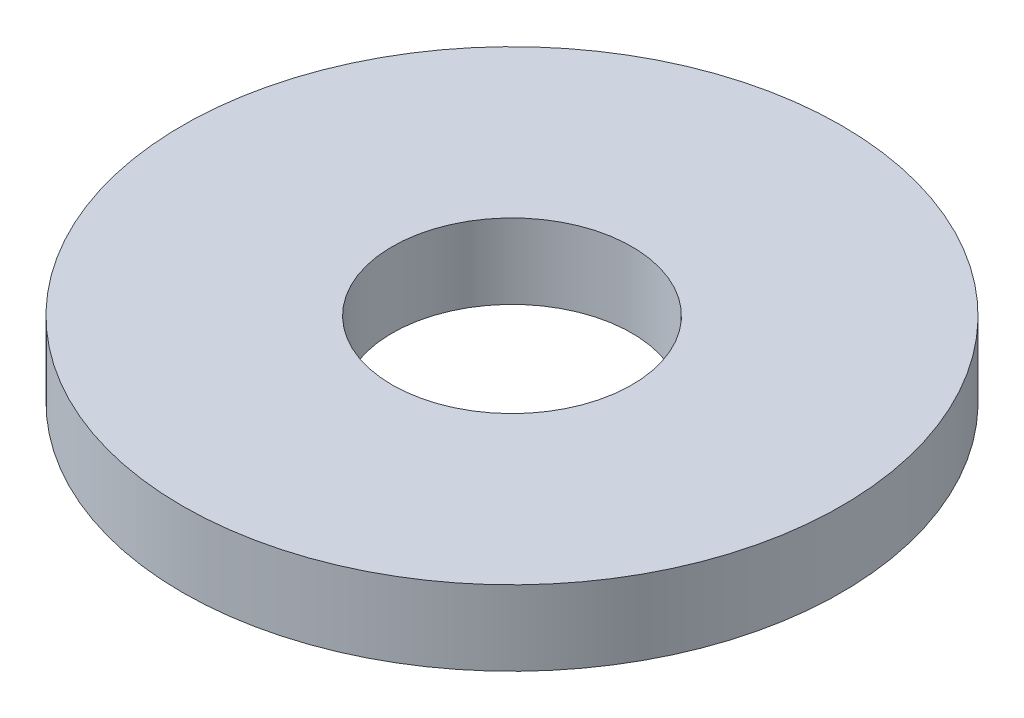
ISO-10303-21;
HEADER;
FILE_DESCRIPTION(('STEP AP214'),'2;1');
FILE_NAME('part.step','',(''),(''),'','','');
FILE_SCHEMA(('AUTOMOTIVE_DESIGN { 1 0 10303 214 1 1 1 1 }'));
ENDSEC;
DATA;
#1=APPLICATION_CONTEXT('core data for automotive mechanical design processes');
#2=APPLICATION_PROTOCOL_DEFINITION('international standard','automotive_design',2000,#1);
#3=PRODUCT_CONTEXT('',#1,'mechanical');
#4=PRODUCT('Part','Part','',(#3));
#5=PRODUCT_RELATED_PRODUCT_CATEGORY('part','',(#4));
#6=PRODUCT_DEFINITION_FORMATION('','',#4);
#7=PRODUCT_DEFINITION_CONTEXT('part definition',#1,'design');
#8=PRODUCT_DEFINITION('design','',#6,#7);
#9=PRODUCT_DEFINITION_SHAPE('','',#8);
#10=(LENGTH_UNIT() NAMED_UNIT(*) SI_UNIT(.MILLI.,.METRE.));
#11=(NAMED_UNIT(*) PLANE_ANGLE_UNIT() SI_UNIT($,.RADIAN.));
#12=(NAMED_UNIT(*) SI_UNIT($,.STERADIAN.) SOLID_ANGLE_UNIT());
#13=UNCERTAINTY_MEASURE_WITH_UNIT(LENGTH_MEASURE(1.E-05),#10,'distance_accuracy_value','');
#14=(GEOMETRIC_REPRESENTATION_CONTEXT(3) GLOBAL_UNCERTAINTY_ASSIGNED_CONTEXT((#13)) GLOBAL_UNIT_ASSIGNED_CONTEXT((#10,
#11,#12)) REPRESENTATION_CONTEXT('',''));
#15=CARTESIAN_POINT('',(0.,0.,0.));
#16=DIRECTION('',(0.,0.,1.));
#17=DIRECTION('',(1.,0.,0.));
#18=AXIS2_PLACEMENT_3D('',#15,#16,#17);
#19=CARTESIAN_POINT('',(0.,1.984375,0.));
#20=DIRECTION('',(0.,1.,0.));
#21=DIRECTION('',(0.,0.,1.));
#22=AXIS2_PLACEMENT_3D('',#19,#20,#21);
#23=PLANE('',#22);
#24=CARTESIAN_POINT('',(0.,1.984375,0.));
#25=DIRECTION('',(0.,1.,0.));
#26=DIRECTION('',(0.,0.,1.));
#27=AXIS2_PLACEMENT_3D('',#24,#25,#26);
#28=CIRCLE('',#27,8.73125);
#29=CARTESIAN_POINT('',(0.,1.984375,8.73125));
#30=VERTEX_POINT('',#29);
#31=EDGE_CURVE('E10',#30,#30,#28,.T.);
#32=ORIENTED_EDGE('',*,*,#31,.T.);
#33=EDGE_LOOP('',(#32));
#34=FACE_BOUND('',#33,.T.);
#35=CARTESIAN_POINT('',(0.,1.984375,0.));
#36=DIRECTION('',(0.,1.,0.));
#37=DIRECTION('',(0.,0.,1.));
#38=AXIS2_PLACEMENT_3D('',#35,#36,#37);
#39=CIRCLE('',#38,3.175);
#40=CARTESIAN_POINT('',(0.,1.984375,3.175));
#41=VERTEX_POINT('',#40);
#42=EDGE_CURVE('E50',#41,#41,#39,.T.);
#43=ORIENTED_EDGE('',*,*,#42,.F.);
#44=EDGE_LOOP('',(#43));
#45=FACE_BOUND('',#44,.T.);
#46=ADVANCED_FACE('F37',(#34,#45),#23,.T.);
#47=CARTESIAN_POINT('',(0.,0.,0.));
#48=DIRECTION('',(0.,1.,0.));
#49=DIRECTION('',(0.,0.,1.));
#50=AXIS2_PLACEMENT_3D('',#47,#48,#49);
#51=PLANE('',#50);
#52=CARTESIAN_POINT('',(0.,0.,0.));
#53=DIRECTION('',(0.,1.,0.));
#54=DIRECTION('',(0.,0.,1.));
#55=AXIS2_PLACEMENT_3D('',#52,#53,#54);
#56=CIRCLE('',#55,8.73125);
#57=CARTESIAN_POINT('',(0.,0.,8.73125));
#58=VERTEX_POINT('',#57);
#59=EDGE_CURVE('E41',#58,#58,#56,.T.);
#60=ORIENTED_EDGE('',*,*,#59,.F.);
#61=EDGE_LOOP('',(#60));
#62=FACE_BOUND('',#61,.T.);
#63=CARTESIAN_POINT('',(0.,0.,0.));
#64=DIRECTION('',(0.,1.,0.));
#65=DIRECTION('',(0.,0.,1.));
#66=AXIS2_PLACEMENT_3D('',#63,#64,#65);
#67=CIRCLE('',#66,3.175);
#68=CARTESIAN_POINT('',(0.,0.,3.175));
#69=VERTEX_POINT('',#68);
#70=EDGE_CURVE('E52',#69,#69,#67,.T.);
#71=ORIENTED_EDGE('',*,*,#70,.T.);
#72=EDGE_LOOP('',(#71));
#73=FACE_BOUND('',#72,.T.);
#74=ADVANCED_FACE('F64',(#62,#73),#51,.F.);
#75=CARTESIAN_POINT('',(0.,1.984375,0.));
#76=DIRECTION('',(0.,-1.,0.));
#77=DIRECTION('',(0.,0.,-1.));
#78=AXIS2_PLACEMENT_3D('',#75,#76,#77);
#79=CYLINDRICAL_SURFACE('',#78,8.73125);
#80=ORIENTED_EDGE('',*,*,#31,.F.);
#81=EDGE_LOOP('',(#80));
#82=FACE_BOUND('',#81,.T.);
#83=ORIENTED_EDGE('',*,*,#59,.T.);
#84=EDGE_LOOP('',(#83));
#85=FACE_BOUND('',#84,.T.);
#86=ADVANCED_FACE('F39',(#82,#85),#79,.T.);
#87=CARTESIAN_POINT('',(0.,1.984375,0.));
#88=DIRECTION('',(0.,-1.,0.));
#89=DIRECTION('',(0.,0.,-1.));
#90=AXIS2_PLACEMENT_3D('',#87,#88,#89);
#91=CYLINDRICAL_SURFACE('',#90,3.175);
#92=ORIENTED_EDGE('',*,*,#42,.T.);
#93=EDGE_LOOP('',(#92));
#94=FACE_BOUND('',#93,.T.);
#95=ORIENTED_EDGE('',*,*,#70,.F.);
#96=EDGE_LOOP('',(#95));
#97=FACE_BOUND('',#96,.T.);
#98=ADVANCED_FACE('F60',(#94,#97),#91,.F.);
#99=CLOSED_SHELL('',(#46,#74,#86,#98));
#100=MANIFOLD_SOLID_BREP('B2',#99);
#101=ADVANCED_BREP_SHAPE_REPRESENTATION('',(#18,#100),#14);
#102=SHAPE_DEFINITION_REPRESENTATION(#9,#101);
ENDSEC;
END-ISO-10303-21;
